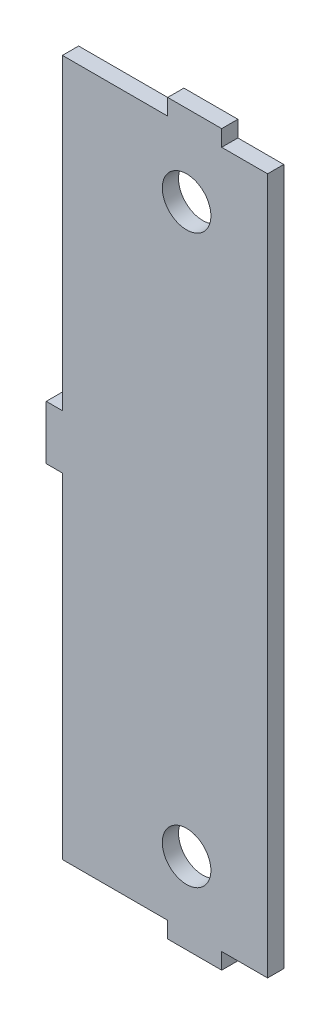
ISO-10303-21;
HEADER;
FILE_DESCRIPTION(('STEP AP214'),'2;1');
FILE_NAME('part.step','',(''),(''),'','','');
FILE_SCHEMA(('AUTOMOTIVE_DESIGN { 1 0 10303 214 1 1 1 1 }'));
ENDSEC;
DATA;
#1=APPLICATION_CONTEXT('core data for automotive mechanical design processes');
#2=APPLICATION_PROTOCOL_DEFINITION('international standard','automotive_design',2000,#1);
#3=PRODUCT_CONTEXT('',#1,'mechanical');
#4=PRODUCT('Part','Part','',(#3));
#5=PRODUCT_RELATED_PRODUCT_CATEGORY('part','',(#4));
#6=PRODUCT_DEFINITION_FORMATION('','',#4);
#7=PRODUCT_DEFINITION_CONTEXT('part definition',#1,'design');
#8=PRODUCT_DEFINITION('design','',#6,#7);
#9=PRODUCT_DEFINITION_SHAPE('','',#8);
#10=(LENGTH_UNIT() NAMED_UNIT(*) SI_UNIT(.MILLI.,.METRE.));
#11=(NAMED_UNIT(*) PLANE_ANGLE_UNIT() SI_UNIT($,.RADIAN.));
#12=(NAMED_UNIT(*) SI_UNIT($,.STERADIAN.) SOLID_ANGLE_UNIT());
#13=UNCERTAINTY_MEASURE_WITH_UNIT(LENGTH_MEASURE(1.E-05),#10,'distance_accuracy_value','');
#14=(GEOMETRIC_REPRESENTATION_CONTEXT(3) GLOBAL_UNCERTAINTY_ASSIGNED_CONTEXT((#13)) GLOBAL_UNIT_ASSIGNED_CONTEXT((#10,
#11,#12)) REPRESENTATION_CONTEXT('',''));
#15=CARTESIAN_POINT('',(0.,0.,0.));
#16=DIRECTION('',(0.,0.,1.));
#17=DIRECTION('',(1.,0.,0.));
#18=AXIS2_PLACEMENT_3D('',#15,#16,#17);
#19=CARTESIAN_POINT('',(0.,64.5,3.));
#20=DIRECTION('',(-1.,0.,0.));
#21=DIRECTION('',(0.,0.,1.));
#22=AXIS2_PLACEMENT_3D('',#19,#20,#21);
#23=PLANE('',#22);
#24=DIRECTION('',(0.,1.,0.));
#25=VECTOR('',#24,1.);
#26=CARTESIAN_POINT('',(0.,64.5,0.));
#27=LINE('',#26,#25);
#28=CARTESIAN_POINT('',(0.,-64.5,0.));
#29=VERTEX_POINT('',#28);
#30=CARTESIAN_POINT('',(0.,64.5,0.));
#31=VERTEX_POINT('',#30);
#32=EDGE_CURVE('E177',#29,#31,#27,.T.);
#33=ORIENTED_EDGE('',*,*,#32,.T.);
#34=DIRECTION('',(0.,0.,-1.));
#35=VECTOR('',#34,1.);
#36=CARTESIAN_POINT('',(0.,64.5,3.));
#37=LINE('',#36,#35);
#38=CARTESIAN_POINT('',(0.,64.5,3.));
#39=VERTEX_POINT('',#38);
#40=EDGE_CURVE('E11',#39,#31,#37,.T.);
#41=ORIENTED_EDGE('',*,*,#40,.F.);
#42=DIRECTION('',(0.,1.,0.));
#43=VECTOR('',#42,1.);
#44=CARTESIAN_POINT('',(0.,64.5,3.));
#45=LINE('',#44,#43);
#46=CARTESIAN_POINT('',(0.,-64.5,3.));
#47=VERTEX_POINT('',#46);
#48=EDGE_CURVE('E208',#47,#39,#45,.T.);
#49=ORIENTED_EDGE('',*,*,#48,.F.);
#50=DIRECTION('',(0.,0.,-1.));
#51=VECTOR('',#50,1.);
#52=CARTESIAN_POINT('',(0.,-64.5,3.));
#53=LINE('',#52,#51);
#54=EDGE_CURVE('E173',#47,#29,#53,.T.);
#55=ORIENTED_EDGE('',*,*,#54,.T.);
#56=EDGE_LOOP('',(#33,#41,#49,#55));
#57=FACE_BOUND('',#56,.T.);
#58=ADVANCED_FACE('F33',(#57),#23,.F.);
#59=CARTESIAN_POINT('',(0.,64.5,3.));
#60=DIRECTION('',(0.,-1.,0.));
#61=DIRECTION('',(0.,0.,-1.));
#62=AXIS2_PLACEMENT_3D('',#59,#60,#61);
#63=PLANE('',#62);
#64=DIRECTION('',(-1.,0.,0.));
#65=VECTOR('',#64,1.);
#66=CARTESIAN_POINT('',(0.,64.5,0.));
#67=LINE('',#66,#65);
#68=CARTESIAN_POINT('',(-8.50000000000001,64.5,0.));
#69=VERTEX_POINT('',#68);
#70=EDGE_CURVE('E180',#31,#69,#67,.T.);
#71=ORIENTED_EDGE('',*,*,#70,.T.);
#72=DIRECTION('',(0.,0.,-1.));
#73=VECTOR('',#72,1.);
#74=CARTESIAN_POINT('',(-8.50000000000001,64.5,3.));
#75=LINE('',#74,#73);
#76=CARTESIAN_POINT('',(-8.50000000000001,64.5,3.));
#77=VERTEX_POINT('',#76);
#78=EDGE_CURVE('E41',#77,#69,#75,.T.);
#79=ORIENTED_EDGE('',*,*,#78,.F.);
#80=DIRECTION('',(-1.,0.,0.));
#81=VECTOR('',#80,1.);
#82=CARTESIAN_POINT('',(0.,64.5,3.));
#83=LINE('',#82,#81);
#84=EDGE_CURVE('E116',#39,#77,#83,.T.);
#85=ORIENTED_EDGE('',*,*,#84,.F.);
#86=ORIENTED_EDGE('',*,*,#40,.T.);
#87=EDGE_LOOP('',(#71,#79,#85,#86));
#88=FACE_BOUND('',#87,.T.);
#89=ADVANCED_FACE('F308',(#88),#63,.F.);
#90=CARTESIAN_POINT('',(-8.50000000000001,64.5,3.));
#91=DIRECTION('',(-1.,0.,0.));
#92=DIRECTION('',(0.,-1.,0.));
#93=AXIS2_PLACEMENT_3D('',#90,#91,#92);
#94=PLANE('',#93);
#95=DIRECTION('',(0.,1.,0.));
#96=VECTOR('',#95,1.);
#97=CARTESIAN_POINT('',(-8.50000000000001,64.5,0.));
#98=LINE('',#97,#96);
#99=CARTESIAN_POINT('',(-8.50000000000004,67.5,0.));
#100=VERTEX_POINT('',#99);
#101=EDGE_CURVE('E183',#69,#100,#98,.T.);
#102=ORIENTED_EDGE('',*,*,#101,.T.);
#103=DIRECTION('',(0.,0.,-1.));
#104=VECTOR('',#103,1.);
#105=CARTESIAN_POINT('',(-8.50000000000004,67.5,3.));
#106=LINE('',#105,#104);
#107=CARTESIAN_POINT('',(-8.50000000000004,67.5,3.));
#108=VERTEX_POINT('',#107);
#109=EDGE_CURVE('E239',#108,#100,#106,.T.);
#110=ORIENTED_EDGE('',*,*,#109,.F.);
#111=DIRECTION('',(0.,1.,0.));
#112=VECTOR('',#111,1.);
#113=CARTESIAN_POINT('',(-8.50000000000001,64.5,3.));
#114=LINE('',#113,#112);
#115=EDGE_CURVE('E247',#77,#108,#114,.T.);
#116=ORIENTED_EDGE('',*,*,#115,.F.);
#117=ORIENTED_EDGE('',*,*,#78,.T.);
#118=EDGE_LOOP('',(#102,#110,#116,#117));
#119=FACE_BOUND('',#118,.T.);
#120=ADVANCED_FACE('F245',(#119),#94,.F.);
#121=CARTESIAN_POINT('',(-18.5,67.5,3.));
#122=DIRECTION('',(0.,-1.,0.));
#123=DIRECTION('',(0.,0.,-1.));
#124=AXIS2_PLACEMENT_3D('',#121,#122,#123);
#125=PLANE('',#124);
#126=DIRECTION('',(-1.,0.,0.));
#127=VECTOR('',#126,1.);
#128=CARTESIAN_POINT('',(-18.5,67.5,0.));
#129=LINE('',#128,#127);
#130=CARTESIAN_POINT('',(-18.5,67.5,0.));
#131=VERTEX_POINT('',#130);
#132=EDGE_CURVE('E185',#100,#131,#129,.T.);
#133=ORIENTED_EDGE('',*,*,#132,.T.);
#134=DIRECTION('',(0.,0.,-1.));
#135=VECTOR('',#134,1.);
#136=CARTESIAN_POINT('',(-18.5,67.5,3.));
#137=LINE('',#136,#135);
#138=CARTESIAN_POINT('',(-18.5,67.5,3.));
#139=VERTEX_POINT('',#138);
#140=EDGE_CURVE('E236',#139,#131,#137,.T.);
#141=ORIENTED_EDGE('',*,*,#140,.F.);
#142=DIRECTION('',(-1.,0.,0.));
#143=VECTOR('',#142,1.);
#144=CARTESIAN_POINT('',(-18.5,67.5,3.));
#145=LINE('',#144,#143);
#146=EDGE_CURVE('E265',#108,#139,#145,.T.);
#147=ORIENTED_EDGE('',*,*,#146,.F.);
#148=ORIENTED_EDGE('',*,*,#109,.T.);
#149=EDGE_LOOP('',(#133,#141,#147,#148));
#150=FACE_BOUND('',#149,.T.);
#151=ADVANCED_FACE('F256',(#150),#125,.F.);
#152=CARTESIAN_POINT('',(-18.5,64.5,3.));
#153=DIRECTION('',(1.,0.,0.));
#154=DIRECTION('',(0.,1.,0.));
#155=AXIS2_PLACEMENT_3D('',#152,#153,#154);
#156=PLANE('',#155);
#157=DIRECTION('',(0.,-1.,0.));
#158=VECTOR('',#157,1.);
#159=CARTESIAN_POINT('',(-18.5,64.5,0.));
#160=LINE('',#159,#158);
#161=CARTESIAN_POINT('',(-18.5,64.5,0.));
#162=VERTEX_POINT('',#161);
#163=EDGE_CURVE('E187',#131,#162,#160,.T.);
#164=ORIENTED_EDGE('',*,*,#163,.T.);
#165=DIRECTION('',(0.,0.,-1.));
#166=VECTOR('',#165,1.);
#167=CARTESIAN_POINT('',(-18.5,64.5,3.));
#168=LINE('',#167,#166);
#169=CARTESIAN_POINT('',(-18.5,64.5,3.));
#170=VERTEX_POINT('',#169);
#171=EDGE_CURVE('E233',#170,#162,#168,.T.);
#172=ORIENTED_EDGE('',*,*,#171,.F.);
#173=DIRECTION('',(0.,-1.,0.));
#174=VECTOR('',#173,1.);
#175=CARTESIAN_POINT('',(-18.5,64.5,3.));
#176=LINE('',#175,#174);
#177=EDGE_CURVE('E262',#139,#170,#176,.T.);
#178=ORIENTED_EDGE('',*,*,#177,.F.);
#179=ORIENTED_EDGE('',*,*,#140,.T.);
#180=EDGE_LOOP('',(#164,#172,#178,#179));
#181=FACE_BOUND('',#180,.T.);
#182=ADVANCED_FACE('F260',(#181),#156,.F.);
#183=CARTESIAN_POINT('',(-18.5,64.5,3.));
#184=DIRECTION('',(0.,-1.,0.));
#185=DIRECTION('',(0.,0.,-1.));
#186=AXIS2_PLACEMENT_3D('',#183,#184,#185);
#187=PLANE('',#186);
#188=DIRECTION('',(-1.,0.,0.));
#189=VECTOR('',#188,1.);
#190=CARTESIAN_POINT('',(-18.5,64.5,0.));
#191=LINE('',#190,#189);
#192=CARTESIAN_POINT('',(-38.,64.5,0.));
#193=VERTEX_POINT('',#192);
#194=EDGE_CURVE('E189',#162,#193,#191,.T.);
#195=ORIENTED_EDGE('',*,*,#194,.T.);
#196=DIRECTION('',(0.,0.,-1.));
#197=VECTOR('',#196,1.);
#198=CARTESIAN_POINT('',(-38.,64.5,3.));
#199=LINE('',#198,#197);
#200=CARTESIAN_POINT('',(-38.,64.5,3.));
#201=VERTEX_POINT('',#200);
#202=EDGE_CURVE('E230',#201,#193,#199,.T.);
#203=ORIENTED_EDGE('',*,*,#202,.F.);
#204=DIRECTION('',(-1.,0.,0.));
#205=VECTOR('',#204,1.);
#206=CARTESIAN_POINT('',(-18.5,64.5,3.));
#207=LINE('',#206,#205);
#208=EDGE_CURVE('E264',#170,#201,#207,.T.);
#209=ORIENTED_EDGE('',*,*,#208,.F.);
#210=ORIENTED_EDGE('',*,*,#171,.T.);
#211=EDGE_LOOP('',(#195,#203,#209,#210));
#212=FACE_BOUND('',#211,.T.);
#213=ADVANCED_FACE('F321',(#212),#187,.F.);
#214=CARTESIAN_POINT('',(-38.,64.5,3.));
#215=DIRECTION('',(1.,0.,0.));
#216=DIRECTION('',(0.,1.,0.));
#217=AXIS2_PLACEMENT_3D('',#214,#215,#216);
#218=PLANE('',#217);
#219=DIRECTION('',(0.,-1.,0.));
#220=VECTOR('',#219,1.);
#221=CARTESIAN_POINT('',(-38.,64.5,0.));
#222=LINE('',#221,#220);
#223=CARTESIAN_POINT('',(-38.,7.5,0.));
#224=VERTEX_POINT('',#223);
#225=EDGE_CURVE('E191',#193,#224,#222,.T.);
#226=ORIENTED_EDGE('',*,*,#225,.T.);
#227=DIRECTION('',(0.,0.,-1.));
#228=VECTOR('',#227,1.);
#229=CARTESIAN_POINT('',(-38.,7.5,3.));
#230=LINE('',#229,#228);
#231=CARTESIAN_POINT('',(-38.,7.5,3.));
#232=VERTEX_POINT('',#231);
#233=EDGE_CURVE('E227',#232,#224,#230,.T.);
#234=ORIENTED_EDGE('',*,*,#233,.F.);
#235=DIRECTION('',(0.,-1.,0.));
#236=VECTOR('',#235,1.);
#237=CARTESIAN_POINT('',(-38.,64.5,3.));
#238=LINE('',#237,#236);
#239=EDGE_CURVE('E267',#201,#232,#238,.T.);
#240=ORIENTED_EDGE('',*,*,#239,.F.);
#241=ORIENTED_EDGE('',*,*,#202,.T.);
#242=EDGE_LOOP('',(#226,#234,#240,#241));
#243=FACE_BOUND('',#242,.T.);
#244=ADVANCED_FACE('F324',(#243),#218,.F.);
#245=CARTESIAN_POINT('',(-38.,7.5,3.));
#246=DIRECTION('',(0.,-1.,0.));
#247=DIRECTION('',(0.,0.,-1.));
#248=AXIS2_PLACEMENT_3D('',#245,#246,#247);
#249=PLANE('',#248);
#250=DIRECTION('',(-1.,0.,0.));
#251=VECTOR('',#250,1.);
#252=CARTESIAN_POINT('',(-38.,7.5,0.));
#253=LINE('',#252,#251);
#254=CARTESIAN_POINT('',(-41.,7.5,0.));
#255=VERTEX_POINT('',#254);
#256=EDGE_CURVE('E193',#224,#255,#253,.T.);
#257=ORIENTED_EDGE('',*,*,#256,.T.);
#258=DIRECTION('',(0.,0.,-1.));
#259=VECTOR('',#258,1.);
#260=CARTESIAN_POINT('',(-41.,7.5,3.));
#261=LINE('',#260,#259);
#262=CARTESIAN_POINT('',(-41.,7.5,3.));
#263=VERTEX_POINT('',#262);
#264=EDGE_CURVE('E224',#263,#255,#261,.T.);
#265=ORIENTED_EDGE('',*,*,#264,.F.);
#266=DIRECTION('',(-1.,0.,0.));
#267=VECTOR('',#266,1.);
#268=CARTESIAN_POINT('',(-38.,7.5,3.));
#269=LINE('',#268,#267);
#270=EDGE_CURVE('E273',#232,#263,#269,.T.);
#271=ORIENTED_EDGE('',*,*,#270,.F.);
#272=ORIENTED_EDGE('',*,*,#233,.T.);
#273=EDGE_LOOP('',(#257,#265,#271,#272));
#274=FACE_BOUND('',#273,.T.);
#275=ADVANCED_FACE('F328',(#274),#249,.F.);
#276=CARTESIAN_POINT('',(-41.,7.5,3.));
#277=DIRECTION('',(1.,0.,0.));
#278=DIRECTION('',(0.,0.,-1.));
#279=AXIS2_PLACEMENT_3D('',#276,#277,#278);
#280=PLANE('',#279);
#281=DIRECTION('',(0.,-1.,0.));
#282=VECTOR('',#281,1.);
#283=CARTESIAN_POINT('',(-41.,7.5,0.));
#284=LINE('',#283,#282);
#285=CARTESIAN_POINT('',(-41.,-2.5,0.));
#286=VERTEX_POINT('',#285);
#287=EDGE_CURVE('E195',#255,#286,#284,.T.);
#288=ORIENTED_EDGE('',*,*,#287,.T.);
#289=DIRECTION('',(0.,0.,-1.));
#290=VECTOR('',#289,1.);
#291=CARTESIAN_POINT('',(-41.,-2.5,3.));
#292=LINE('',#291,#290);
#293=CARTESIAN_POINT('',(-41.,-2.5,3.));
#294=VERTEX_POINT('',#293);
#295=EDGE_CURVE('E221',#294,#286,#292,.T.);
#296=ORIENTED_EDGE('',*,*,#295,.F.);
#297=DIRECTION('',(0.,-1.,0.));
#298=VECTOR('',#297,1.);
#299=CARTESIAN_POINT('',(-41.,7.5,3.));
#300=LINE('',#299,#298);
#301=EDGE_CURVE('E275',#263,#294,#300,.T.);
#302=ORIENTED_EDGE('',*,*,#301,.F.);
#303=ORIENTED_EDGE('',*,*,#264,.T.);
#304=EDGE_LOOP('',(#288,#296,#302,#303));
#305=FACE_BOUND('',#304,.T.);
#306=ADVANCED_FACE('F332',(#305),#280,.F.);
#307=CARTESIAN_POINT('',(-38.,-2.5,3.));
#308=DIRECTION('',(0.,1.,0.));
#309=DIRECTION('',(-1.,0.,0.));
#310=AXIS2_PLACEMENT_3D('',#307,#308,#309);
#311=PLANE('',#310);
#312=DIRECTION('',(1.,0.,0.));
#313=VECTOR('',#312,1.);
#314=CARTESIAN_POINT('',(-38.,-2.5,0.));
#315=LINE('',#314,#313);
#316=CARTESIAN_POINT('',(-38.,-2.5,0.));
#317=VERTEX_POINT('',#316);
#318=EDGE_CURVE('E197',#286,#317,#315,.T.);
#319=ORIENTED_EDGE('',*,*,#318,.T.);
#320=DIRECTION('',(0.,0.,-1.));
#321=VECTOR('',#320,1.);
#322=CARTESIAN_POINT('',(-38.,-2.5,3.));
#323=LINE('',#322,#321);
#324=CARTESIAN_POINT('',(-38.,-2.5,3.));
#325=VERTEX_POINT('',#324);
#326=EDGE_CURVE('E218',#325,#317,#323,.T.);
#327=ORIENTED_EDGE('',*,*,#326,.F.);
#328=DIRECTION('',(1.,0.,0.));
#329=VECTOR('',#328,1.);
#330=CARTESIAN_POINT('',(-38.,-2.5,3.));
#331=LINE('',#330,#329);
#332=EDGE_CURVE('E277',#294,#325,#331,.T.);
#333=ORIENTED_EDGE('',*,*,#332,.F.);
#334=ORIENTED_EDGE('',*,*,#295,.T.);
#335=EDGE_LOOP('',(#319,#327,#333,#334));
#336=FACE_BOUND('',#335,.T.);
#337=ADVANCED_FACE('F336',(#336),#311,.F.);
#338=CARTESIAN_POINT('',(-38.,-2.5,3.));
#339=DIRECTION('',(1.,0.,0.));
#340=DIRECTION('',(0.,1.,0.));
#341=AXIS2_PLACEMENT_3D('',#338,#339,#340);
#342=PLANE('',#341);
#343=DIRECTION('',(0.,-1.,0.));
#344=VECTOR('',#343,1.);
#345=CARTESIAN_POINT('',(-38.,-2.5,0.));
#346=LINE('',#345,#344);
#347=CARTESIAN_POINT('',(-38.,-64.5,0.));
#348=VERTEX_POINT('',#347);
#349=EDGE_CURVE('E199',#317,#348,#346,.T.);
#350=ORIENTED_EDGE('',*,*,#349,.T.);
#351=DIRECTION('',(0.,0.,-1.));
#352=VECTOR('',#351,1.);
#353=CARTESIAN_POINT('',(-38.,-64.5,3.));
#354=LINE('',#353,#352);
#355=CARTESIAN_POINT('',(-38.,-64.5,3.));
#356=VERTEX_POINT('',#355);
#357=EDGE_CURVE('E215',#356,#348,#354,.T.);
#358=ORIENTED_EDGE('',*,*,#357,.F.);
#359=DIRECTION('',(0.,-1.,0.));
#360=VECTOR('',#359,1.);
#361=CARTESIAN_POINT('',(-38.,-2.5,3.));
#362=LINE('',#361,#360);
#363=EDGE_CURVE('E279',#325,#356,#362,.T.);
#364=ORIENTED_EDGE('',*,*,#363,.F.);
#365=ORIENTED_EDGE('',*,*,#326,.T.);
#366=EDGE_LOOP('',(#350,#358,#364,#365));
#367=FACE_BOUND('',#366,.T.);
#368=ADVANCED_FACE('F340',(#367),#342,.F.);
#369=CARTESIAN_POINT('',(-18.5,-64.5,3.));
#370=DIRECTION('',(0.,1.,0.));
#371=DIRECTION('',(0.,0.,1.));
#372=AXIS2_PLACEMENT_3D('',#369,#370,#371);
#373=PLANE('',#372);
#374=DIRECTION('',(1.,0.,0.));
#375=VECTOR('',#374,1.);
#376=CARTESIAN_POINT('',(-18.5,-64.5,0.));
#377=LINE('',#376,#375);
#378=CARTESIAN_POINT('',(-18.5,-64.5,0.));
#379=VERTEX_POINT('',#378);
#380=EDGE_CURVE('E201',#348,#379,#377,.T.);
#381=ORIENTED_EDGE('',*,*,#380,.T.);
#382=DIRECTION('',(0.,0.,-1.));
#383=VECTOR('',#382,1.);
#384=CARTESIAN_POINT('',(-18.5,-64.5,3.));
#385=LINE('',#384,#383);
#386=CARTESIAN_POINT('',(-18.5,-64.5,3.));
#387=VERTEX_POINT('',#386);
#388=EDGE_CURVE('E212',#387,#379,#385,.T.);
#389=ORIENTED_EDGE('',*,*,#388,.F.);
#390=DIRECTION('',(1.,0.,0.));
#391=VECTOR('',#390,1.);
#392=CARTESIAN_POINT('',(-18.5,-64.5,3.));
#393=LINE('',#392,#391);
#394=EDGE_CURVE('E281',#356,#387,#393,.T.);
#395=ORIENTED_EDGE('',*,*,#394,.F.);
#396=ORIENTED_EDGE('',*,*,#357,.T.);
#397=EDGE_LOOP('',(#381,#389,#395,#396));
#398=FACE_BOUND('',#397,.T.);
#399=ADVANCED_FACE('F287',(#398),#373,.F.);
#400=CARTESIAN_POINT('',(-18.5,-64.5,3.));
#401=DIRECTION('',(1.,0.,0.));
#402=DIRECTION('',(0.,1.,0.));
#403=AXIS2_PLACEMENT_3D('',#400,#401,#402);
#404=PLANE('',#403);
#405=DIRECTION('',(0.,-1.,0.));
#406=VECTOR('',#405,1.);
#407=CARTESIAN_POINT('',(-18.5,-64.5,0.));
#408=LINE('',#407,#406);
#409=CARTESIAN_POINT('',(-18.5,-67.5,0.));
#410=VERTEX_POINT('',#409);
#411=EDGE_CURVE('E203',#379,#410,#408,.T.);
#412=ORIENTED_EDGE('',*,*,#411,.T.);
#413=DIRECTION('',(0.,0.,-1.));
#414=VECTOR('',#413,1.);
#415=CARTESIAN_POINT('',(-18.5,-67.5,3.));
#416=LINE('',#415,#414);
#417=CARTESIAN_POINT('',(-18.5,-67.5,3.));
#418=VERTEX_POINT('',#417);
#419=EDGE_CURVE('E168',#418,#410,#416,.T.);
#420=ORIENTED_EDGE('',*,*,#419,.F.);
#421=DIRECTION('',(0.,-1.,0.));
#422=VECTOR('',#421,1.);
#423=CARTESIAN_POINT('',(-18.5,-64.5,3.));
#424=LINE('',#423,#422);
#425=EDGE_CURVE('E159',#387,#418,#424,.T.);
#426=ORIENTED_EDGE('',*,*,#425,.F.);
#427=ORIENTED_EDGE('',*,*,#388,.T.);
#428=EDGE_LOOP('',(#412,#420,#426,#427));
#429=FACE_BOUND('',#428,.T.);
#430=ADVANCED_FACE('F291',(#429),#404,.F.);
#431=CARTESIAN_POINT('',(-18.5,-67.5,3.));
#432=DIRECTION('',(0.,1.,0.));
#433=DIRECTION('',(0.,0.,1.));
#434=AXIS2_PLACEMENT_3D('',#431,#432,#433);
#435=PLANE('',#434);
#436=DIRECTION('',(1.,0.,0.));
#437=VECTOR('',#436,1.);
#438=CARTESIAN_POINT('',(-18.5,-67.5,0.));
#439=LINE('',#438,#437);
#440=CARTESIAN_POINT('',(-8.50000000000004,-67.5,0.));
#441=VERTEX_POINT('',#440);
#442=EDGE_CURVE('E167',#410,#441,#439,.T.);
#443=ORIENTED_EDGE('',*,*,#442,.T.);
#444=DIRECTION('',(0.,0.,-1.));
#445=VECTOR('',#444,1.);
#446=CARTESIAN_POINT('',(-8.50000000000004,-67.5,3.));
#447=LINE('',#446,#445);
#448=CARTESIAN_POINT('',(-8.50000000000004,-67.5,3.));
#449=VERTEX_POINT('',#448);
#450=EDGE_CURVE('E164',#449,#441,#447,.T.);
#451=ORIENTED_EDGE('',*,*,#450,.F.);
#452=DIRECTION('',(1.,0.,0.));
#453=VECTOR('',#452,1.);
#454=CARTESIAN_POINT('',(-18.5,-67.5,3.));
#455=LINE('',#454,#453);
#456=EDGE_CURVE('E153',#418,#449,#455,.T.);
#457=ORIENTED_EDGE('',*,*,#456,.F.);
#458=ORIENTED_EDGE('',*,*,#419,.T.);
#459=EDGE_LOOP('',(#443,#451,#457,#458));
#460=FACE_BOUND('',#459,.T.);
#461=ADVANCED_FACE('F165',(#460),#435,.F.);
#462=CARTESIAN_POINT('',(-8.49999999999998,-64.5,3.));
#463=DIRECTION('',(-1.,0.,0.));
#464=DIRECTION('',(0.,-1.,0.));
#465=AXIS2_PLACEMENT_3D('',#462,#463,#464);
#466=PLANE('',#465);
#467=DIRECTION('',(0.,1.,0.));
#468=VECTOR('',#467,1.);
#469=CARTESIAN_POINT('',(-8.49999999999998,-64.5,0.));
#470=LINE('',#469,#468);
#471=CARTESIAN_POINT('',(-8.49999999999998,-64.5,0.));
#472=VERTEX_POINT('',#471);
#473=EDGE_CURVE('E102',#441,#472,#470,.T.);
#474=ORIENTED_EDGE('',*,*,#473,.T.);
#475=DIRECTION('',(0.,0.,-1.));
#476=VECTOR('',#475,1.);
#477=CARTESIAN_POINT('',(-8.49999999999998,-64.5,3.));
#478=LINE('',#477,#476);
#479=CARTESIAN_POINT('',(-8.49999999999998,-64.5,3.));
#480=VERTEX_POINT('',#479);
#481=EDGE_CURVE('E169',#480,#472,#478,.T.);
#482=ORIENTED_EDGE('',*,*,#481,.F.);
#483=DIRECTION('',(0.,1.,0.));
#484=VECTOR('',#483,1.);
#485=CARTESIAN_POINT('',(-8.49999999999998,-64.5,3.));
#486=LINE('',#485,#484);
#487=EDGE_CURVE('E157',#449,#480,#486,.T.);
#488=ORIENTED_EDGE('',*,*,#487,.F.);
#489=ORIENTED_EDGE('',*,*,#450,.T.);
#490=EDGE_LOOP('',(#474,#482,#488,#489));
#491=FACE_BOUND('',#490,.T.);
#492=ADVANCED_FACE('F171',(#491),#466,.F.);
#493=CARTESIAN_POINT('',(0.,-64.5,3.));
#494=DIRECTION('',(0.,1.,0.));
#495=DIRECTION('',(0.,0.,1.));
#496=AXIS2_PLACEMENT_3D('',#493,#494,#495);
#497=PLANE('',#496);
#498=DIRECTION('',(1.,0.,0.));
#499=VECTOR('',#498,1.);
#500=CARTESIAN_POINT('',(0.,-64.5,0.));
#501=LINE('',#500,#499);
#502=EDGE_CURVE('E108',#472,#29,#501,.T.);
#503=ORIENTED_EDGE('',*,*,#502,.T.);
#504=ORIENTED_EDGE('',*,*,#54,.F.);
#505=DIRECTION('',(1.,0.,0.));
#506=VECTOR('',#505,1.);
#507=CARTESIAN_POINT('',(0.,-64.5,3.));
#508=LINE('',#507,#506);
#509=EDGE_CURVE('E49',#480,#47,#508,.T.);
#510=ORIENTED_EDGE('',*,*,#509,.F.);
#511=ORIENTED_EDGE('',*,*,#481,.T.);
#512=EDGE_LOOP('',(#503,#504,#510,#511));
#513=FACE_BOUND('',#512,.T.);
#514=ADVANCED_FACE('F295',(#513),#497,.F.);
#515=CARTESIAN_POINT('',(0.,0.,3.));
#516=DIRECTION('',(0.,0.,-1.));
#517=DIRECTION('',(-1.,0.,0.));
#518=AXIS2_PLACEMENT_3D('',#515,#516,#517);
#519=PLANE('',#518);
#520=CARTESIAN_POINT('',(-15.,52.5,3.));
#521=DIRECTION('',(0.,0.,1.));
#522=DIRECTION('',(1.,0.,0.));
#523=AXIS2_PLACEMENT_3D('',#520,#521,#522);
#524=CIRCLE('',#523,4.50000000000001);
#525=CARTESIAN_POINT('',(-10.5,52.5,3.));
#526=VERTEX_POINT('',#525);
#527=EDGE_CURVE('E181',#526,#526,#524,.T.);
#528=ORIENTED_EDGE('',*,*,#527,.F.);
#529=EDGE_LOOP('',(#528));
#530=FACE_BOUND('',#529,.T.);
#531=CARTESIAN_POINT('',(-15.,-52.5,3.));
#532=DIRECTION('',(0.,0.,1.));
#533=DIRECTION('',(1.,0.,0.));
#534=AXIS2_PLACEMENT_3D('',#531,#532,#533);
#535=CIRCLE('',#534,4.50000000000001);
#536=CARTESIAN_POINT('',(-10.5,-52.5,3.));
#537=VERTEX_POINT('',#536);
#538=EDGE_CURVE('E401',#537,#537,#535,.T.);
#539=ORIENTED_EDGE('',*,*,#538,.F.);
#540=EDGE_LOOP('',(#539));
#541=FACE_BOUND('',#540,.T.);
#542=ORIENTED_EDGE('',*,*,#48,.T.);
#543=ORIENTED_EDGE('',*,*,#84,.T.);
#544=ORIENTED_EDGE('',*,*,#115,.T.);
#545=ORIENTED_EDGE('',*,*,#146,.T.);
#546=ORIENTED_EDGE('',*,*,#177,.T.);
#547=ORIENTED_EDGE('',*,*,#208,.T.);
#548=ORIENTED_EDGE('',*,*,#239,.T.);
#549=ORIENTED_EDGE('',*,*,#270,.T.);
#550=ORIENTED_EDGE('',*,*,#301,.T.);
#551=ORIENTED_EDGE('',*,*,#332,.T.);
#552=ORIENTED_EDGE('',*,*,#363,.T.);
#553=ORIENTED_EDGE('',*,*,#394,.T.);
#554=ORIENTED_EDGE('',*,*,#425,.T.);
#555=ORIENTED_EDGE('',*,*,#456,.T.);
#556=ORIENTED_EDGE('',*,*,#487,.T.);
#557=ORIENTED_EDGE('',*,*,#509,.T.);
#558=EDGE_LOOP('',(#542,#543,#544,#545,#546,#547,#548,#549,#550,#551,#552,#553,#554,#555,#556,#557));
#559=FACE_BOUND('',#558,.T.);
#560=ADVANCED_FACE('F155',(#530,#541,#559),#519,.F.);
#561=CARTESIAN_POINT('',(0.,0.,0.));
#562=DIRECTION('',(0.,0.,-1.));
#563=DIRECTION('',(-1.,0.,0.));
#564=AXIS2_PLACEMENT_3D('',#561,#562,#563);
#565=PLANE('',#564);
#566=CARTESIAN_POINT('',(-15.,52.5,0.));
#567=DIRECTION('',(0.,0.,1.));
#568=DIRECTION('',(1.,0.,0.));
#569=AXIS2_PLACEMENT_3D('',#566,#567,#568);
#570=CIRCLE('',#569,4.50000000000001);
#571=CARTESIAN_POINT('',(-10.5,52.5,0.));
#572=VERTEX_POINT('',#571);
#573=EDGE_CURVE('E400',#572,#572,#570,.T.);
#574=ORIENTED_EDGE('',*,*,#573,.T.);
#575=EDGE_LOOP('',(#574));
#576=FACE_BOUND('',#575,.T.);
#577=CARTESIAN_POINT('',(-15.,-52.5,0.));
#578=DIRECTION('',(0.,0.,1.));
#579=DIRECTION('',(1.,0.,0.));
#580=AXIS2_PLACEMENT_3D('',#577,#578,#579);
#581=CIRCLE('',#580,4.50000000000001);
#582=CARTESIAN_POINT('',(-10.5,-52.5,0.));
#583=VERTEX_POINT('',#582);
#584=EDGE_CURVE('E405',#583,#583,#581,.T.);
#585=ORIENTED_EDGE('',*,*,#584,.T.);
#586=EDGE_LOOP('',(#585));
#587=FACE_BOUND('',#586,.T.);
#588=ORIENTED_EDGE('',*,*,#32,.F.);
#589=ORIENTED_EDGE('',*,*,#502,.F.);
#590=ORIENTED_EDGE('',*,*,#473,.F.);
#591=ORIENTED_EDGE('',*,*,#442,.F.);
#592=ORIENTED_EDGE('',*,*,#411,.F.);
#593=ORIENTED_EDGE('',*,*,#380,.F.);
#594=ORIENTED_EDGE('',*,*,#349,.F.);
#595=ORIENTED_EDGE('',*,*,#318,.F.);
#596=ORIENTED_EDGE('',*,*,#287,.F.);
#597=ORIENTED_EDGE('',*,*,#256,.F.);
#598=ORIENTED_EDGE('',*,*,#225,.F.);
#599=ORIENTED_EDGE('',*,*,#194,.F.);
#600=ORIENTED_EDGE('',*,*,#163,.F.);
#601=ORIENTED_EDGE('',*,*,#132,.F.);
#602=ORIENTED_EDGE('',*,*,#101,.F.);
#603=ORIENTED_EDGE('',*,*,#70,.F.);
#604=EDGE_LOOP('',(#588,#589,#590,#591,#592,#593,#594,#595,#596,#597,#598,#599,#600,#601,#602,#603));
#605=FACE_BOUND('',#604,.T.);
#606=ADVANCED_FACE('F251',(#576,#587,#605),#565,.T.);
#607=CARTESIAN_POINT('',(-15.,-52.5,3.));
#608=DIRECTION('',(0.,0.,-1.));
#609=DIRECTION('',(-1.,0.,0.));
#610=AXIS2_PLACEMENT_3D('',#607,#608,#609);
#611=CYLINDRICAL_SURFACE('',#610,4.50000000000001);
#612=ORIENTED_EDGE('',*,*,#538,.T.);
#613=EDGE_LOOP('',(#612));
#614=FACE_BOUND('',#613,.T.);
#615=ORIENTED_EDGE('',*,*,#584,.F.);
#616=EDGE_LOOP('',(#615));
#617=FACE_BOUND('',#616,.T.);
#618=ADVANCED_FACE('F373',(#614,#617),#611,.F.);
#619=CARTESIAN_POINT('',(-15.,52.5,3.));
#620=DIRECTION('',(0.,0.,-1.));
#621=DIRECTION('',(-1.,0.,0.));
#622=AXIS2_PLACEMENT_3D('',#619,#620,#621);
#623=CYLINDRICAL_SURFACE('',#622,4.50000000000001);
#624=ORIENTED_EDGE('',*,*,#527,.T.);
#625=EDGE_LOOP('',(#624));
#626=FACE_BOUND('',#625,.T.);
#627=ORIENTED_EDGE('',*,*,#573,.F.);
#628=EDGE_LOOP('',(#627));
#629=FACE_BOUND('',#628,.T.);
#630=ADVANCED_FACE('F381',(#626,#629),#623,.F.);
#631=CLOSED_SHELL('',(#58,#89,#120,#151,#182,#213,#244,#275,#306,#337,#368,#399,#430,#461,#492,
#514,#560,#606,#618,#630));
#632=MANIFOLD_SOLID_BREP('B2',#631);
#633=ADVANCED_BREP_SHAPE_REPRESENTATION('',(#18,#632),#14);
#634=SHAPE_DEFINITION_REPRESENTATION(#9,#633);
ENDSEC;
END-ISO-10303-21;
